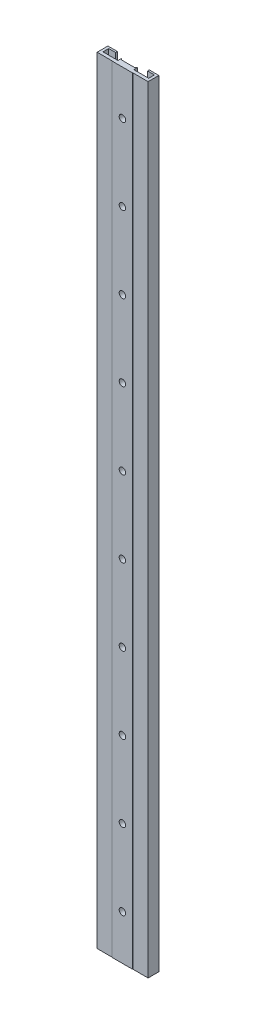
ISO-10303-21;
HEADER;
FILE_DESCRIPTION(('STEP AP214'),'2;1');
FILE_NAME('part.step','',(''),(''),'','','');
FILE_SCHEMA(('AUTOMOTIVE_DESIGN { 1 0 10303 214 1 1 1 1 }'));
ENDSEC;
DATA;
#1=APPLICATION_CONTEXT('core data for automotive mechanical design processes');
#2=APPLICATION_PROTOCOL_DEFINITION('international standard','automotive_design',2000,#1);
#3=PRODUCT_CONTEXT('',#1,'mechanical');
#4=PRODUCT('Part','Part','',(#3));
#5=PRODUCT_RELATED_PRODUCT_CATEGORY('part','',(#4));
#6=PRODUCT_DEFINITION_FORMATION('','',#4);
#7=PRODUCT_DEFINITION_CONTEXT('part definition',#1,'design');
#8=PRODUCT_DEFINITION('design','',#6,#7);
#9=PRODUCT_DEFINITION_SHAPE('','',#8);
#10=(LENGTH_UNIT() NAMED_UNIT(*) SI_UNIT(.MILLI.,.METRE.));
#11=(NAMED_UNIT(*) PLANE_ANGLE_UNIT() SI_UNIT($,.RADIAN.));
#12=(NAMED_UNIT(*) SI_UNIT($,.STERADIAN.) SOLID_ANGLE_UNIT());
#13=UNCERTAINTY_MEASURE_WITH_UNIT(LENGTH_MEASURE(1.E-05),#10,'distance_accuracy_value','');
#14=(GEOMETRIC_REPRESENTATION_CONTEXT(3) GLOBAL_UNCERTAINTY_ASSIGNED_CONTEXT((#13)) GLOBAL_UNIT_ASSIGNED_CONTEXT((#10,
#11,#12)) REPRESENTATION_CONTEXT('',''));
#15=CARTESIAN_POINT('',(0.,0.,0.));
#16=DIRECTION('',(0.,0.,1.));
#17=DIRECTION('',(1.,0.,0.));
#18=AXIS2_PLACEMENT_3D('',#15,#16,#17);
#19=CARTESIAN_POINT('',(32.512,609.6,0.));
#20=DIRECTION('',(-1.,0.,0.));
#21=DIRECTION('',(0.,0.,1.));
#22=AXIS2_PLACEMENT_3D('',#19,#20,#21);
#23=PLANE('',#22);
#24=DIRECTION('',(0.,0.,-1.));
#25=VECTOR('',#24,1.);
#26=CARTESIAN_POINT('',(32.512,0.,0.));
#27=LINE('',#26,#25);
#28=CARTESIAN_POINT('',(32.512,0.,-7.0612));
#29=VERTEX_POINT('',#28);
#30=CARTESIAN_POINT('',(32.512,0.,-8.4582));
#31=VERTEX_POINT('',#30);
#32=EDGE_CURVE('E233',#29,#31,#27,.T.);
#33=ORIENTED_EDGE('',*,*,#32,.F.);
#34=DIRECTION('',(0.,-1.,0.));
#35=VECTOR('',#34,1.);
#36=CARTESIAN_POINT('',(32.512,609.6,-7.0612));
#37=LINE('',#36,#35);
#38=CARTESIAN_POINT('',(32.512,609.6,-7.0612));
#39=VERTEX_POINT('',#38);
#40=EDGE_CURVE('E11',#39,#29,#37,.T.);
#41=ORIENTED_EDGE('',*,*,#40,.F.);
#42=DIRECTION('',(0.,0.,-1.));
#43=VECTOR('',#42,1.);
#44=CARTESIAN_POINT('',(32.512,609.6,0.));
#45=LINE('',#44,#43);
#46=CARTESIAN_POINT('',(32.512,609.6,-8.4582));
#47=VERTEX_POINT('',#46);
#48=EDGE_CURVE('E301',#39,#47,#45,.T.);
#49=ORIENTED_EDGE('',*,*,#48,.T.);
#50=DIRECTION('',(0.,-1.,0.));
#51=VECTOR('',#50,1.);
#52=CARTESIAN_POINT('',(32.512,609.6,-8.4582));
#53=LINE('',#52,#51);
#54=EDGE_CURVE('E148',#47,#31,#53,.T.);
#55=ORIENTED_EDGE('',*,*,#54,.T.);
#56=EDGE_LOOP('',(#33,#41,#49,#55));
#57=FACE_BOUND('',#56,.T.);
#58=ADVANCED_FACE('F41',(#57),#23,.T.);
#59=CARTESIAN_POINT('',(0.,609.6,-7.0612));
#60=DIRECTION('',(0.,0.,1.));
#61=DIRECTION('',(1.,0.,0.));
#62=AXIS2_PLACEMENT_3D('',#59,#60,#61);
#63=PLANE('',#62);
#64=DIRECTION('',(-1.,0.,0.));
#65=VECTOR('',#64,1.);
#66=CARTESIAN_POINT('',(0.,0.,-7.0612));
#67=LINE('',#66,#65);
#68=CARTESIAN_POINT('',(37.973,0.,-7.0612));
#69=VERTEX_POINT('',#68);
#70=EDGE_CURVE('E237',#69,#29,#67,.T.);
#71=ORIENTED_EDGE('',*,*,#70,.F.);
#72=DIRECTION('',(0.,-1.,0.));
#73=VECTOR('',#72,1.);
#74=CARTESIAN_POINT('',(37.973,609.6,-7.0612));
#75=LINE('',#74,#73);
#76=CARTESIAN_POINT('',(37.973,609.6,-7.0612));
#77=VERTEX_POINT('',#76);
#78=EDGE_CURVE('E51',#77,#69,#75,.T.);
#79=ORIENTED_EDGE('',*,*,#78,.F.);
#80=DIRECTION('',(-1.,0.,0.));
#81=VECTOR('',#80,1.);
#82=CARTESIAN_POINT('',(0.,609.6,-7.0612));
#83=LINE('',#82,#81);
#84=EDGE_CURVE('E409',#77,#39,#83,.T.);
#85=ORIENTED_EDGE('',*,*,#84,.T.);
#86=ORIENTED_EDGE('',*,*,#40,.T.);
#87=EDGE_LOOP('',(#71,#79,#85,#86));
#88=FACE_BOUND('',#87,.T.);
#89=ADVANCED_FACE('F467',(#88),#63,.T.);
#90=CARTESIAN_POINT('',(37.973,609.6,0.));
#91=DIRECTION('',(-1.,0.,0.));
#92=DIRECTION('',(0.,0.,1.));
#93=AXIS2_PLACEMENT_3D('',#90,#91,#92);
#94=PLANE('',#93);
#95=DIRECTION('',(0.,0.,-1.));
#96=VECTOR('',#95,1.);
#97=CARTESIAN_POINT('',(37.973,0.,0.));
#98=LINE('',#97,#96);
#99=CARTESIAN_POINT('',(37.973,0.,-2.54));
#100=VERTEX_POINT('',#99);
#101=EDGE_CURVE('E242',#100,#69,#98,.T.);
#102=ORIENTED_EDGE('',*,*,#101,.F.);
#103=DIRECTION('',(0.,-1.,0.));
#104=VECTOR('',#103,1.);
#105=CARTESIAN_POINT('',(37.973,609.6,-2.54));
#106=LINE('',#105,#104);
#107=CARTESIAN_POINT('',(37.973,609.6,-2.54));
#108=VERTEX_POINT('',#107);
#109=EDGE_CURVE('E344',#108,#100,#106,.T.);
#110=ORIENTED_EDGE('',*,*,#109,.F.);
#111=DIRECTION('',(0.,0.,-1.));
#112=VECTOR('',#111,1.);
#113=CARTESIAN_POINT('',(37.973,609.6,0.));
#114=LINE('',#113,#112);
#115=EDGE_CURVE('E412',#108,#77,#114,.T.);
#116=ORIENTED_EDGE('',*,*,#115,.T.);
#117=ORIENTED_EDGE('',*,*,#78,.T.);
#118=EDGE_LOOP('',(#102,#110,#116,#117));
#119=FACE_BOUND('',#118,.T.);
#120=ADVANCED_FACE('F470',(#119),#94,.T.);
#121=CARTESIAN_POINT('',(0.,609.6,-2.54));
#122=DIRECTION('',(0.,0.,-1.));
#123=DIRECTION('',(-1.,0.,0.));
#124=AXIS2_PLACEMENT_3D('',#121,#122,#123);
#125=PLANE('',#124);
#126=DIRECTION('',(1.,0.,0.));
#127=VECTOR('',#126,1.);
#128=CARTESIAN_POINT('',(0.,0.,-2.54));
#129=LINE('',#128,#127);
#130=CARTESIAN_POINT('',(26.2509,0.,-2.54));
#131=VERTEX_POINT('',#130);
#132=EDGE_CURVE('E246',#131,#100,#129,.T.);
#133=ORIENTED_EDGE('',*,*,#132,.F.);
#134=DIRECTION('',(0.,-1.,0.));
#135=VECTOR('',#134,1.);
#136=CARTESIAN_POINT('',(26.2509,609.6,-2.54));
#137=LINE('',#136,#135);
#138=CARTESIAN_POINT('',(26.2509,609.6,-2.54));
#139=VERTEX_POINT('',#138);
#140=EDGE_CURVE('E341',#139,#131,#137,.T.);
#141=ORIENTED_EDGE('',*,*,#140,.F.);
#142=DIRECTION('',(1.,0.,0.));
#143=VECTOR('',#142,1.);
#144=CARTESIAN_POINT('',(0.,609.6,-2.54));
#145=LINE('',#144,#143);
#146=EDGE_CURVE('E415',#139,#108,#145,.T.);
#147=ORIENTED_EDGE('',*,*,#146,.T.);
#148=ORIENTED_EDGE('',*,*,#109,.T.);
#149=EDGE_LOOP('',(#133,#141,#147,#148));
#150=FACE_BOUND('',#149,.T.);
#151=ADVANCED_FACE('F475',(#150),#125,.T.);
#152=CARTESIAN_POINT('',(26.2509,609.6,0.));
#153=DIRECTION('',(1.,0.,0.));
#154=DIRECTION('',(0.,0.,-1.));
#155=AXIS2_PLACEMENT_3D('',#152,#153,#154);
#156=PLANE('',#155);
#157=DIRECTION('',(0.,0.,1.));
#158=VECTOR('',#157,1.);
#159=CARTESIAN_POINT('',(26.2509,0.,0.));
#160=LINE('',#159,#158);
#161=CARTESIAN_POINT('',(26.2509,0.,-5.26999469496826));
#162=VERTEX_POINT('',#161);
#163=EDGE_CURVE('E250',#162,#131,#160,.T.);
#164=ORIENTED_EDGE('',*,*,#163,.F.);
#165=DIRECTION('',(0.,-1.,0.));
#166=VECTOR('',#165,1.);
#167=CARTESIAN_POINT('',(26.2509,609.6,-5.26999469496826));
#168=LINE('',#167,#166);
#169=CARTESIAN_POINT('',(26.2509,609.6,-5.26999469496826));
#170=VERTEX_POINT('',#169);
#171=EDGE_CURVE('E338',#170,#162,#168,.T.);
#172=ORIENTED_EDGE('',*,*,#171,.F.);
#173=DIRECTION('',(0.,0.,1.));
#174=VECTOR('',#173,1.);
#175=CARTESIAN_POINT('',(26.2509,609.6,0.));
#176=LINE('',#175,#174);
#177=EDGE_CURVE('E418',#170,#139,#176,.T.);
#178=ORIENTED_EDGE('',*,*,#177,.T.);
#179=ORIENTED_EDGE('',*,*,#140,.T.);
#180=EDGE_LOOP('',(#164,#172,#178,#179));
#181=FACE_BOUND('',#180,.T.);
#182=ADVANCED_FACE('F478',(#181),#156,.T.);
#183=CARTESIAN_POINT('',(10.4904526525158,609.6,10.4904526525159));
#184=DIRECTION('',(-0.707106781186546,0.,-0.707106781186549));
#185=DIRECTION('',(-0.707106781186549,0.,0.707106781186546));
#186=AXIS2_PLACEMENT_3D('',#183,#184,#185);
#187=PLANE('',#186);
#188=DIRECTION('',(0.707106781186549,0.,-0.707106781186546));
#189=VECTOR('',#188,1.);
#190=CARTESIAN_POINT('',(10.4904526525158,0.,10.4904526525159));
#191=LINE('',#190,#189);
#192=CARTESIAN_POINT('',(25.2989053050317,0.,-4.318));
#193=VERTEX_POINT('',#192);
#194=EDGE_CURVE('E255',#193,#162,#191,.T.);
#195=ORIENTED_EDGE('',*,*,#194,.F.);
#196=DIRECTION('',(0.,-1.,0.));
#197=VECTOR('',#196,1.);
#198=CARTESIAN_POINT('',(25.2989053050317,609.6,-4.318));
#199=LINE('',#198,#197);
#200=CARTESIAN_POINT('',(25.2989053050317,609.6,-4.318));
#201=VERTEX_POINT('',#200);
#202=EDGE_CURVE('E335',#201,#193,#199,.T.);
#203=ORIENTED_EDGE('',*,*,#202,.F.);
#204=DIRECTION('',(0.707106781186549,0.,-0.707106781186546));
#205=VECTOR('',#204,1.);
#206=CARTESIAN_POINT('',(10.4904526525158,609.6,10.4904526525159));
#207=LINE('',#206,#205);
#208=EDGE_CURVE('E422',#201,#170,#207,.T.);
#209=ORIENTED_EDGE('',*,*,#208,.T.);
#210=ORIENTED_EDGE('',*,*,#171,.T.);
#211=EDGE_LOOP('',(#195,#203,#209,#210));
#212=FACE_BOUND('',#211,.T.);
#213=ADVANCED_FACE('F483',(#212),#187,.T.);
#214=CARTESIAN_POINT('',(0.,609.6,-4.318));
#215=DIRECTION('',(0.,0.,-1.));
#216=DIRECTION('',(-1.,0.,0.));
#217=AXIS2_PLACEMENT_3D('',#214,#215,#216);
#218=PLANE('',#217);
#219=CARTESIAN_POINT('',(20.0024999999943,35.1790000000001,-4.318));
#220=DIRECTION('',(0.,0.,-1.));
#221=DIRECTION('',(-1.,0.,0.));
#222=AXIS2_PLACEMENT_3D('',#219,#220,#221);
#223=CIRCLE('',#222,2.54);
#224=CARTESIAN_POINT('',(17.4624999999943,35.1790000000001,-4.318));
#225=VERTEX_POINT('',#224);
#226=EDGE_CURVE('E391',#225,#225,#223,.T.);
#227=ORIENTED_EDGE('',*,*,#226,.F.);
#228=EDGE_LOOP('',(#227));
#229=FACE_BOUND('',#228,.T.);
#230=CARTESIAN_POINT('',(20.002499999995,95.1230000000001,-4.318));
#231=DIRECTION('',(0.,0.,-1.));
#232=DIRECTION('',(-1.,0.,0.));
#233=AXIS2_PLACEMENT_3D('',#230,#231,#232);
#234=CIRCLE('',#233,2.54);
#235=CARTESIAN_POINT('',(17.462499999995,95.1230000000001,-4.318));
#236=VERTEX_POINT('',#235);
#237=EDGE_CURVE('E381',#236,#236,#234,.T.);
#238=ORIENTED_EDGE('',*,*,#237,.F.);
#239=EDGE_LOOP('',(#238));
#240=FACE_BOUND('',#239,.T.);
#241=CARTESIAN_POINT('',(20.0024999999956,155.067,-4.318));
#242=DIRECTION('',(0.,0.,-1.));
#243=DIRECTION('',(-1.,0.,0.));
#244=AXIS2_PLACEMENT_3D('',#241,#242,#243);
#245=CIRCLE('',#244,2.54);
#246=CARTESIAN_POINT('',(17.4624999999956,155.067,-4.318));
#247=VERTEX_POINT('',#246);
#248=EDGE_CURVE('E378',#247,#247,#245,.T.);
#249=ORIENTED_EDGE('',*,*,#248,.F.);
#250=EDGE_LOOP('',(#249));
#251=FACE_BOUND('',#250,.T.);
#252=CARTESIAN_POINT('',(20.0024999999962,215.011,-4.318));
#253=DIRECTION('',(0.,0.,-1.));
#254=DIRECTION('',(-1.,0.,0.));
#255=AXIS2_PLACEMENT_3D('',#252,#253,#254);
#256=CIRCLE('',#255,2.54);
#257=CARTESIAN_POINT('',(17.4624999999962,215.011,-4.318));
#258=VERTEX_POINT('',#257);
#259=EDGE_CURVE('E375',#258,#258,#256,.T.);
#260=ORIENTED_EDGE('',*,*,#259,.F.);
#261=EDGE_LOOP('',(#260));
#262=FACE_BOUND('',#261,.T.);
#263=CARTESIAN_POINT('',(20.0024999999969,274.955,-4.318));
#264=DIRECTION('',(0.,0.,-1.));
#265=DIRECTION('',(-1.,0.,0.));
#266=AXIS2_PLACEMENT_3D('',#263,#264,#265);
#267=CIRCLE('',#266,2.54);
#268=CARTESIAN_POINT('',(17.4624999999969,274.955,-4.318));
#269=VERTEX_POINT('',#268);
#270=EDGE_CURVE('E371',#269,#269,#267,.T.);
#271=ORIENTED_EDGE('',*,*,#270,.F.);
#272=EDGE_LOOP('',(#271));
#273=FACE_BOUND('',#272,.T.);
#274=CARTESIAN_POINT('',(20.0024999999975,334.899,-4.318));
#275=DIRECTION('',(0.,0.,-1.));
#276=DIRECTION('',(-1.,0.,0.));
#277=AXIS2_PLACEMENT_3D('',#274,#275,#276);
#278=CIRCLE('',#277,2.54);
#279=CARTESIAN_POINT('',(17.4624999999975,334.899,-4.318));
#280=VERTEX_POINT('',#279);
#281=EDGE_CURVE('E367',#280,#280,#278,.T.);
#282=ORIENTED_EDGE('',*,*,#281,.F.);
#283=EDGE_LOOP('',(#282));
#284=FACE_BOUND('',#283,.T.);
#285=CARTESIAN_POINT('',(20.0024999999981,394.843,-4.318));
#286=DIRECTION('',(0.,0.,-1.));
#287=DIRECTION('',(-1.,0.,0.));
#288=AXIS2_PLACEMENT_3D('',#285,#286,#287);
#289=CIRCLE('',#288,2.54);
#290=CARTESIAN_POINT('',(17.4624999999981,394.843,-4.318));
#291=VERTEX_POINT('',#290);
#292=EDGE_CURVE('E363',#291,#291,#289,.T.);
#293=ORIENTED_EDGE('',*,*,#292,.F.);
#294=EDGE_LOOP('',(#293));
#295=FACE_BOUND('',#294,.T.);
#296=CARTESIAN_POINT('',(20.0024999999987,454.787,-4.318));
#297=DIRECTION('',(0.,0.,-1.));
#298=DIRECTION('',(-1.,0.,0.));
#299=AXIS2_PLACEMENT_3D('',#296,#297,#298);
#300=CIRCLE('',#299,2.54);
#301=CARTESIAN_POINT('',(17.4624999999987,454.787,-4.318));
#302=VERTEX_POINT('',#301);
#303=EDGE_CURVE('E359',#302,#302,#300,.T.);
#304=ORIENTED_EDGE('',*,*,#303,.F.);
#305=EDGE_LOOP('',(#304));
#306=FACE_BOUND('',#305,.T.);
#307=CARTESIAN_POINT('',(20.0024999999994,514.731,-4.318));
#308=DIRECTION('',(0.,0.,-1.));
#309=DIRECTION('',(-1.,0.,0.));
#310=AXIS2_PLACEMENT_3D('',#307,#308,#309);
#311=CIRCLE('',#310,2.53999999999999);
#312=CARTESIAN_POINT('',(17.4624999999994,514.731,-4.318));
#313=VERTEX_POINT('',#312);
#314=EDGE_CURVE('E355',#313,#313,#311,.T.);
#315=ORIENTED_EDGE('',*,*,#314,.F.);
#316=EDGE_LOOP('',(#315));
#317=FACE_BOUND('',#316,.T.);
#318=CARTESIAN_POINT('',(20.0025,574.675,-4.318));
#319=DIRECTION('',(0.,0.,-1.));
#320=DIRECTION('',(-1.,0.,0.));
#321=AXIS2_PLACEMENT_3D('',#318,#319,#320);
#322=CIRCLE('',#321,2.53999999999999);
#323=CARTESIAN_POINT('',(17.4625,574.675,-4.318));
#324=VERTEX_POINT('',#323);
#325=EDGE_CURVE('E351',#324,#324,#322,.T.);
#326=ORIENTED_EDGE('',*,*,#325,.F.);
#327=EDGE_LOOP('',(#326));
#328=FACE_BOUND('',#327,.T.);
#329=DIRECTION('',(1.,0.,0.));
#330=VECTOR('',#329,1.);
#331=CARTESIAN_POINT('',(0.,0.,-4.318));
#332=LINE('',#331,#330);
#333=CARTESIAN_POINT('',(14.7060946949683,0.,-4.318));
#334=VERTEX_POINT('',#333);
#335=EDGE_CURVE('E259',#334,#193,#332,.T.);
#336=ORIENTED_EDGE('',*,*,#335,.F.);
#337=DIRECTION('',(0.,-1.,0.));
#338=VECTOR('',#337,1.);
#339=CARTESIAN_POINT('',(14.7060946949683,609.6,-4.318));
#340=LINE('',#339,#338);
#341=CARTESIAN_POINT('',(14.7060946949683,609.6,-4.318));
#342=VERTEX_POINT('',#341);
#343=EDGE_CURVE('E333',#342,#334,#340,.T.);
#344=ORIENTED_EDGE('',*,*,#343,.F.);
#345=DIRECTION('',(1.,0.,0.));
#346=VECTOR('',#345,1.);
#347=CARTESIAN_POINT('',(0.,609.6,-4.318));
#348=LINE('',#347,#346);
#349=EDGE_CURVE('E425',#342,#201,#348,.T.);
#350=ORIENTED_EDGE('',*,*,#349,.T.);
#351=ORIENTED_EDGE('',*,*,#202,.T.);
#352=EDGE_LOOP('',(#336,#344,#350,#351));
#353=FACE_BOUND('',#352,.T.);
#354=ADVANCED_FACE('F486',(#229,#240,#251,#262,#273,#284,#295,#306,#317,#328,#353),#218,.T.);
#355=CARTESIAN_POINT('',(9.51204734748415,609.6,-9.51204734748413));
#356=DIRECTION('',(0.707106781186548,0.,-0.707106781186547));
#357=DIRECTION('',(-0.707106781186547,0.,-0.707106781186548));
#358=AXIS2_PLACEMENT_3D('',#355,#356,#357);
#359=PLANE('',#358);
#360=DIRECTION('',(0.707106781186547,0.,0.707106781186548));
#361=VECTOR('',#360,1.);
#362=CARTESIAN_POINT('',(9.51204734748415,0.,-9.51204734748413));
#363=LINE('',#362,#361);
#364=CARTESIAN_POINT('',(13.7541,0.,-5.26999469496826));
#365=VERTEX_POINT('',#364);
#366=EDGE_CURVE('E263',#365,#334,#363,.T.);
#367=ORIENTED_EDGE('',*,*,#366,.F.);
#368=DIRECTION('',(0.,-1.,0.));
#369=VECTOR('',#368,1.);
#370=CARTESIAN_POINT('',(13.7541,609.6,-5.26999469496826));
#371=LINE('',#370,#369);
#372=CARTESIAN_POINT('',(13.7541,609.6,-5.26999469496826));
#373=VERTEX_POINT('',#372);
#374=EDGE_CURVE('E331',#373,#365,#371,.T.);
#375=ORIENTED_EDGE('',*,*,#374,.F.);
#376=DIRECTION('',(0.707106781186547,0.,0.707106781186548));
#377=VECTOR('',#376,1.);
#378=CARTESIAN_POINT('',(9.51204734748415,609.6,-9.51204734748413));
#379=LINE('',#378,#377);
#380=EDGE_CURVE('E428',#373,#342,#379,.T.);
#381=ORIENTED_EDGE('',*,*,#380,.T.);
#382=ORIENTED_EDGE('',*,*,#343,.T.);
#383=EDGE_LOOP('',(#367,#375,#381,#382));
#384=FACE_BOUND('',#383,.T.);
#385=ADVANCED_FACE('F491',(#384),#359,.T.);
#386=CARTESIAN_POINT('',(13.7541,609.6,0.));
#387=DIRECTION('',(-1.,0.,0.));
#388=DIRECTION('',(0.,0.,1.));
#389=AXIS2_PLACEMENT_3D('',#386,#387,#388);
#390=PLANE('',#389);
#391=DIRECTION('',(0.,0.,-1.));
#392=VECTOR('',#391,1.);
#393=CARTESIAN_POINT('',(13.7541,0.,0.));
#394=LINE('',#393,#392);
#395=CARTESIAN_POINT('',(13.7541,0.,-2.54));
#396=VERTEX_POINT('',#395);
#397=EDGE_CURVE('E266',#396,#365,#394,.T.);
#398=ORIENTED_EDGE('',*,*,#397,.F.);
#399=DIRECTION('',(0.,-1.,0.));
#400=VECTOR('',#399,1.);
#401=CARTESIAN_POINT('',(13.7541,609.6,-2.54));
#402=LINE('',#401,#400);
#403=CARTESIAN_POINT('',(13.7541,609.6,-2.54));
#404=VERTEX_POINT('',#403);
#405=EDGE_CURVE('E329',#404,#396,#402,.T.);
#406=ORIENTED_EDGE('',*,*,#405,.F.);
#407=DIRECTION('',(0.,0.,-1.));
#408=VECTOR('',#407,1.);
#409=CARTESIAN_POINT('',(13.7541,609.6,0.));
#410=LINE('',#409,#408);
#411=EDGE_CURVE('E431',#404,#373,#410,.T.);
#412=ORIENTED_EDGE('',*,*,#411,.T.);
#413=ORIENTED_EDGE('',*,*,#374,.T.);
#414=EDGE_LOOP('',(#398,#406,#412,#413));
#415=FACE_BOUND('',#414,.T.);
#416=ADVANCED_FACE('F494',(#415),#390,.T.);
#417=CARTESIAN_POINT('',(2.032,0.,-2.54));
#418=VERTEX_POINT('',#417);
#419=EDGE_CURVE('E251',#418,#396,#129,.T.);
#420=ORIENTED_EDGE('',*,*,#419,.F.);
#421=DIRECTION('',(0.,-1.,0.));
#422=VECTOR('',#421,1.);
#423=CARTESIAN_POINT('',(2.032,609.6,-2.54));
#424=LINE('',#423,#422);
#425=CARTESIAN_POINT('',(2.032,609.6,-2.54));
#426=VERTEX_POINT('',#425);
#427=EDGE_CURVE('E327',#426,#418,#424,.T.);
#428=ORIENTED_EDGE('',*,*,#427,.F.);
#429=EDGE_CURVE('E419',#426,#404,#145,.T.);
#430=ORIENTED_EDGE('',*,*,#429,.T.);
#431=ORIENTED_EDGE('',*,*,#405,.T.);
#432=EDGE_LOOP('',(#420,#428,#430,#431));
#433=FACE_BOUND('',#432,.T.);
#434=ADVANCED_FACE('F501',(#433),#125,.T.);
#435=CARTESIAN_POINT('',(2.032,609.6,0.));
#436=DIRECTION('',(1.,0.,0.));
#437=DIRECTION('',(0.,0.,-1.));
#438=AXIS2_PLACEMENT_3D('',#435,#436,#437);
#439=PLANE('',#438);
#440=DIRECTION('',(0.,0.,1.));
#441=VECTOR('',#440,1.);
#442=CARTESIAN_POINT('',(2.032,0.,0.));
#443=LINE('',#442,#441);
#444=CARTESIAN_POINT('',(2.032,0.,-7.0612));
#445=VERTEX_POINT('',#444);
#446=EDGE_CURVE('E269',#445,#418,#443,.T.);
#447=ORIENTED_EDGE('',*,*,#446,.F.);
#448=DIRECTION('',(0.,-1.,0.));
#449=VECTOR('',#448,1.);
#450=CARTESIAN_POINT('',(2.032,609.6,-7.0612));
#451=LINE('',#450,#449);
#452=CARTESIAN_POINT('',(2.032,609.6,-7.0612));
#453=VERTEX_POINT('',#452);
#454=EDGE_CURVE('E325',#453,#445,#451,.T.);
#455=ORIENTED_EDGE('',*,*,#454,.F.);
#456=DIRECTION('',(0.,0.,1.));
#457=VECTOR('',#456,1.);
#458=CARTESIAN_POINT('',(2.032,609.6,0.));
#459=LINE('',#458,#457);
#460=EDGE_CURVE('E434',#453,#426,#459,.T.);
#461=ORIENTED_EDGE('',*,*,#460,.T.);
#462=ORIENTED_EDGE('',*,*,#427,.T.);
#463=EDGE_LOOP('',(#447,#455,#461,#462));
#464=FACE_BOUND('',#463,.T.);
#465=ADVANCED_FACE('F504',(#464),#439,.T.);
#466=CARTESIAN_POINT('',(0.,609.6,-7.0612));
#467=DIRECTION('',(0.,0.,1.));
#468=DIRECTION('',(1.,0.,0.));
#469=AXIS2_PLACEMENT_3D('',#466,#467,#468);
#470=PLANE('',#469);
#471=DIRECTION('',(-1.,0.,0.));
#472=VECTOR('',#471,1.);
#473=CARTESIAN_POINT('',(0.,0.,-7.0612));
#474=LINE('',#473,#472);
#475=CARTESIAN_POINT('',(7.493,0.,-7.0612));
#476=VERTEX_POINT('',#475);
#477=EDGE_CURVE('E272',#476,#445,#474,.T.);
#478=ORIENTED_EDGE('',*,*,#477,.F.);
#479=DIRECTION('',(0.,-1.,0.));
#480=VECTOR('',#479,1.);
#481=CARTESIAN_POINT('',(7.493,609.6,-7.0612));
#482=LINE('',#481,#480);
#483=CARTESIAN_POINT('',(7.493,609.6,-7.0612));
#484=VERTEX_POINT('',#483);
#485=EDGE_CURVE('E323',#484,#476,#482,.T.);
#486=ORIENTED_EDGE('',*,*,#485,.F.);
#487=DIRECTION('',(-1.,0.,0.));
#488=VECTOR('',#487,1.);
#489=CARTESIAN_POINT('',(0.,609.6,-7.0612));
#490=LINE('',#489,#488);
#491=EDGE_CURVE('E437',#484,#453,#490,.T.);
#492=ORIENTED_EDGE('',*,*,#491,.T.);
#493=ORIENTED_EDGE('',*,*,#454,.T.);
#494=EDGE_LOOP('',(#478,#486,#492,#493));
#495=FACE_BOUND('',#494,.T.);
#496=ADVANCED_FACE('F509',(#495),#470,.T.);
#497=CARTESIAN_POINT('',(7.493,609.6,0.));
#498=DIRECTION('',(1.,0.,0.));
#499=DIRECTION('',(0.,0.,-1.));
#500=AXIS2_PLACEMENT_3D('',#497,#498,#499);
#501=PLANE('',#500);
#502=DIRECTION('',(0.,0.,1.));
#503=VECTOR('',#502,1.);
#504=CARTESIAN_POINT('',(7.493,0.,0.));
#505=LINE('',#504,#503);
#506=CARTESIAN_POINT('',(7.493,0.,-8.4582));
#507=VERTEX_POINT('',#506);
#508=EDGE_CURVE('E275',#507,#476,#505,.T.);
#509=ORIENTED_EDGE('',*,*,#508,.F.);
#510=DIRECTION('',(0.,-1.,0.));
#511=VECTOR('',#510,1.);
#512=CARTESIAN_POINT('',(7.493,609.6,-8.4582));
#513=LINE('',#512,#511);
#514=CARTESIAN_POINT('',(7.493,609.6,-8.4582));
#515=VERTEX_POINT('',#514);
#516=EDGE_CURVE('E321',#515,#507,#513,.T.);
#517=ORIENTED_EDGE('',*,*,#516,.F.);
#518=DIRECTION('',(0.,0.,1.));
#519=VECTOR('',#518,1.);
#520=CARTESIAN_POINT('',(7.493,609.6,0.));
#521=LINE('',#520,#519);
#522=EDGE_CURVE('E440',#515,#484,#521,.T.);
#523=ORIENTED_EDGE('',*,*,#522,.T.);
#524=ORIENTED_EDGE('',*,*,#485,.T.);
#525=EDGE_LOOP('',(#509,#517,#523,#524));
#526=FACE_BOUND('',#525,.T.);
#527=ADVANCED_FACE('F512',(#526),#501,.T.);
#528=CARTESIAN_POINT('',(0.,609.6,-8.4582));
#529=DIRECTION('',(0.,0.,-1.));
#530=DIRECTION('',(-1.,0.,0.));
#531=AXIS2_PLACEMENT_3D('',#528,#529,#530);
#532=PLANE('',#531);
#533=DIRECTION('',(1.,0.,0.));
#534=VECTOR('',#533,1.);
#535=CARTESIAN_POINT('',(0.,0.,-8.4582));
#536=LINE('',#535,#534);
#537=CARTESIAN_POINT('',(0.,0.,-8.4582));
#538=VERTEX_POINT('',#537);
#539=EDGE_CURVE('E278',#538,#507,#536,.T.);
#540=ORIENTED_EDGE('',*,*,#539,.F.);
#541=DIRECTION('',(0.,-1.,0.));
#542=VECTOR('',#541,1.);
#543=CARTESIAN_POINT('',(0.,609.6,-8.4582));
#544=LINE('',#543,#542);
#545=CARTESIAN_POINT('',(0.,609.6,-8.4582));
#546=VERTEX_POINT('',#545);
#547=EDGE_CURVE('E319',#546,#538,#544,.T.);
#548=ORIENTED_EDGE('',*,*,#547,.F.);
#549=DIRECTION('',(1.,0.,0.));
#550=VECTOR('',#549,1.);
#551=CARTESIAN_POINT('',(0.,609.6,-8.4582));
#552=LINE('',#551,#550);
#553=EDGE_CURVE('E443',#546,#515,#552,.T.);
#554=ORIENTED_EDGE('',*,*,#553,.T.);
#555=ORIENTED_EDGE('',*,*,#516,.T.);
#556=EDGE_LOOP('',(#540,#548,#554,#555));
#557=FACE_BOUND('',#556,.T.);
#558=ADVANCED_FACE('F517',(#557),#532,.T.);
#559=CARTESIAN_POINT('',(0.,609.6,0.));
#560=DIRECTION('',(-1.,0.,0.));
#561=DIRECTION('',(0.,0.,1.));
#562=AXIS2_PLACEMENT_3D('',#559,#560,#561);
#563=PLANE('',#562);
#564=DIRECTION('',(0.,0.,-1.));
#565=VECTOR('',#564,1.);
#566=CARTESIAN_POINT('',(0.,0.,0.));
#567=LINE('',#566,#565);
#568=CARTESIAN_POINT('',(0.,0.,0.));
#569=VERTEX_POINT('',#568);
#570=EDGE_CURVE('E281',#569,#538,#567,.T.);
#571=ORIENTED_EDGE('',*,*,#570,.F.);
#572=DIRECTION('',(0.,-1.,0.));
#573=VECTOR('',#572,1.);
#574=CARTESIAN_POINT('',(0.,609.6,0.));
#575=LINE('',#574,#573);
#576=CARTESIAN_POINT('',(0.,609.6,0.));
#577=VERTEX_POINT('',#576);
#578=EDGE_CURVE('E317',#577,#569,#575,.T.);
#579=ORIENTED_EDGE('',*,*,#578,.F.);
#580=DIRECTION('',(0.,0.,-1.));
#581=VECTOR('',#580,1.);
#582=CARTESIAN_POINT('',(0.,609.6,0.));
#583=LINE('',#582,#581);
#584=EDGE_CURVE('E446',#577,#546,#583,.T.);
#585=ORIENTED_EDGE('',*,*,#584,.T.);
#586=ORIENTED_EDGE('',*,*,#547,.T.);
#587=EDGE_LOOP('',(#571,#579,#585,#586));
#588=FACE_BOUND('',#587,.T.);
#589=ADVANCED_FACE('F520',(#588),#563,.T.);
#590=CARTESIAN_POINT('',(0.,609.6,0.));
#591=DIRECTION('',(0.,0.,-1.));
#592=DIRECTION('',(-1.,0.,0.));
#593=AXIS2_PLACEMENT_3D('',#590,#591,#592);
#594=PLANE('',#593);
#595=DIRECTION('',(1.,0.,0.));
#596=VECTOR('',#595,1.);
#597=CARTESIAN_POINT('',(0.,0.,0.));
#598=LINE('',#597,#596);
#599=CARTESIAN_POINT('',(11.9761,0.,0.));
#600=VERTEX_POINT('',#599);
#601=EDGE_CURVE('E284',#569,#600,#598,.T.);
#602=ORIENTED_EDGE('',*,*,#601,.T.);
#603=DIRECTION('',(0.,-1.,0.));
#604=VECTOR('',#603,1.);
#605=CARTESIAN_POINT('',(11.9761,609.6,0.));
#606=LINE('',#605,#604);
#607=CARTESIAN_POINT('',(11.9761,609.6,0.));
#608=VERTEX_POINT('',#607);
#609=EDGE_CURVE('E314',#608,#600,#606,.T.);
#610=ORIENTED_EDGE('',*,*,#609,.F.);
#611=DIRECTION('',(1.,0.,0.));
#612=VECTOR('',#611,1.);
#613=CARTESIAN_POINT('',(0.,609.6,0.));
#614=LINE('',#613,#612);
#615=EDGE_CURVE('E218',#577,#608,#614,.T.);
#616=ORIENTED_EDGE('',*,*,#615,.F.);
#617=ORIENTED_EDGE('',*,*,#578,.T.);
#618=EDGE_LOOP('',(#602,#610,#616,#617));
#619=FACE_BOUND('',#618,.T.);
#620=ADVANCED_FACE('F526',(#619),#594,.F.);
#621=CARTESIAN_POINT('',(11.9761,609.6,0.));
#622=DIRECTION('',(1.,0.,0.));
#623=DIRECTION('',(0.,0.,-1.));
#624=AXIS2_PLACEMENT_3D('',#621,#622,#623);
#625=PLANE('',#624);
#626=DIRECTION('',(0.,0.,1.));
#627=VECTOR('',#626,1.);
#628=CARTESIAN_POINT('',(11.9761,0.,0.));
#629=LINE('',#628,#627);
#630=CARTESIAN_POINT('',(11.9761,0.,0.1524));
#631=VERTEX_POINT('',#630);
#632=EDGE_CURVE('E286',#600,#631,#629,.T.);
#633=ORIENTED_EDGE('',*,*,#632,.T.);
#634=DIRECTION('',(0.,-1.,0.));
#635=VECTOR('',#634,1.);
#636=CARTESIAN_POINT('',(11.9761,609.6,0.1524));
#637=LINE('',#636,#635);
#638=CARTESIAN_POINT('',(11.9761,609.6,0.1524));
#639=VERTEX_POINT('',#638);
#640=EDGE_CURVE('E311',#639,#631,#637,.T.);
#641=ORIENTED_EDGE('',*,*,#640,.F.);
#642=DIRECTION('',(0.,0.,1.));
#643=VECTOR('',#642,1.);
#644=CARTESIAN_POINT('',(11.9761,609.6,0.));
#645=LINE('',#644,#643);
#646=EDGE_CURVE('E449',#608,#639,#645,.T.);
#647=ORIENTED_EDGE('',*,*,#646,.F.);
#648=ORIENTED_EDGE('',*,*,#609,.T.);
#649=EDGE_LOOP('',(#633,#641,#647,#648));
#650=FACE_BOUND('',#649,.T.);
#651=ADVANCED_FACE('F530',(#650),#625,.F.);
#652=CARTESIAN_POINT('',(0.,609.6,0.1524));
#653=DIRECTION('',(0.,0.,-1.));
#654=DIRECTION('',(-1.,0.,0.));
#655=AXIS2_PLACEMENT_3D('',#652,#653,#654);
#656=PLANE('',#655);
#657=CARTESIAN_POINT('',(20.0024999999943,35.1790000000001,0.152400000000052));
#658=DIRECTION('',(0.,0.,-1.));
#659=DIRECTION('',(-1.,0.,0.));
#660=AXIS2_PLACEMENT_3D('',#657,#658,#659);
#661=CIRCLE('',#660,2.54);
#662=CARTESIAN_POINT('',(17.4624999999943,35.1790000000001,0.152400000000052));
#663=VERTEX_POINT('',#662);
#664=EDGE_CURVE('E44',#663,#663,#661,.T.);
#665=ORIENTED_EDGE('',*,*,#664,.T.);
#666=EDGE_LOOP('',(#665));
#667=FACE_BOUND('',#666,.T.);
#668=CARTESIAN_POINT('',(20.002499999995,95.1230000000001,0.152400000000052));
#669=DIRECTION('',(0.,0.,-1.));
#670=DIRECTION('',(-1.,0.,0.));
#671=AXIS2_PLACEMENT_3D('',#668,#669,#670);
#672=CIRCLE('',#671,2.54);
#673=CARTESIAN_POINT('',(17.462499999995,95.1230000000001,0.152400000000052));
#674=VERTEX_POINT('',#673);
#675=EDGE_CURVE('E379',#674,#674,#672,.T.);
#676=ORIENTED_EDGE('',*,*,#675,.T.);
#677=EDGE_LOOP('',(#676));
#678=FACE_BOUND('',#677,.T.);
#679=CARTESIAN_POINT('',(20.0024999999956,155.067,0.152400000000052));
#680=DIRECTION('',(0.,0.,-1.));
#681=DIRECTION('',(-1.,0.,0.));
#682=AXIS2_PLACEMENT_3D('',#679,#680,#681);
#683=CIRCLE('',#682,2.54);
#684=CARTESIAN_POINT('',(17.4624999999956,155.067,0.152400000000052));
#685=VERTEX_POINT('',#684);
#686=EDGE_CURVE('E376',#685,#685,#683,.T.);
#687=ORIENTED_EDGE('',*,*,#686,.T.);
#688=EDGE_LOOP('',(#687));
#689=FACE_BOUND('',#688,.T.);
#690=CARTESIAN_POINT('',(20.0024999999962,215.011,0.152400000000052));
#691=DIRECTION('',(0.,0.,-1.));
#692=DIRECTION('',(-1.,0.,0.));
#693=AXIS2_PLACEMENT_3D('',#690,#691,#692);
#694=CIRCLE('',#693,2.54);
#695=CARTESIAN_POINT('',(17.4624999999962,215.011,0.152400000000052));
#696=VERTEX_POINT('',#695);
#697=EDGE_CURVE('E372',#696,#696,#694,.T.);
#698=ORIENTED_EDGE('',*,*,#697,.T.);
#699=EDGE_LOOP('',(#698));
#700=FACE_BOUND('',#699,.T.);
#701=CARTESIAN_POINT('',(20.0024999999969,274.955,0.152400000000052));
#702=DIRECTION('',(0.,0.,-1.));
#703=DIRECTION('',(-1.,0.,0.));
#704=AXIS2_PLACEMENT_3D('',#701,#702,#703);
#705=CIRCLE('',#704,2.54);
#706=CARTESIAN_POINT('',(17.4624999999969,274.955,0.152400000000052));
#707=VERTEX_POINT('',#706);
#708=EDGE_CURVE('E368',#707,#707,#705,.T.);
#709=ORIENTED_EDGE('',*,*,#708,.T.);
#710=EDGE_LOOP('',(#709));
#711=FACE_BOUND('',#710,.T.);
#712=CARTESIAN_POINT('',(20.0024999999975,334.899,0.152400000000052));
#713=DIRECTION('',(0.,0.,-1.));
#714=DIRECTION('',(-1.,0.,0.));
#715=AXIS2_PLACEMENT_3D('',#712,#713,#714);
#716=CIRCLE('',#715,2.54);
#717=CARTESIAN_POINT('',(17.4624999999975,334.899,0.152400000000052));
#718=VERTEX_POINT('',#717);
#719=EDGE_CURVE('E364',#718,#718,#716,.T.);
#720=ORIENTED_EDGE('',*,*,#719,.T.);
#721=EDGE_LOOP('',(#720));
#722=FACE_BOUND('',#721,.T.);
#723=CARTESIAN_POINT('',(20.0024999999981,394.843,0.152400000000052));
#724=DIRECTION('',(0.,0.,-1.));
#725=DIRECTION('',(-1.,0.,0.));
#726=AXIS2_PLACEMENT_3D('',#723,#724,#725);
#727=CIRCLE('',#726,2.54);
#728=CARTESIAN_POINT('',(17.4624999999981,394.843,0.152400000000052));
#729=VERTEX_POINT('',#728);
#730=EDGE_CURVE('E360',#729,#729,#727,.T.);
#731=ORIENTED_EDGE('',*,*,#730,.T.);
#732=EDGE_LOOP('',(#731));
#733=FACE_BOUND('',#732,.T.);
#734=CARTESIAN_POINT('',(20.0024999999987,454.787,0.152400000000052));
#735=DIRECTION('',(0.,0.,-1.));
#736=DIRECTION('',(-1.,0.,0.));
#737=AXIS2_PLACEMENT_3D('',#734,#735,#736);
#738=CIRCLE('',#737,2.54);
#739=CARTESIAN_POINT('',(17.4624999999987,454.787,0.152400000000052));
#740=VERTEX_POINT('',#739);
#741=EDGE_CURVE('E356',#740,#740,#738,.T.);
#742=ORIENTED_EDGE('',*,*,#741,.T.);
#743=EDGE_LOOP('',(#742));
#744=FACE_BOUND('',#743,.T.);
#745=CARTESIAN_POINT('',(20.0024999999994,514.731,0.152400000000052));
#746=DIRECTION('',(0.,0.,-1.));
#747=DIRECTION('',(-1.,0.,0.));
#748=AXIS2_PLACEMENT_3D('',#745,#746,#747);
#749=CIRCLE('',#748,2.53999999999999);
#750=CARTESIAN_POINT('',(17.4624999999994,514.731,0.152400000000052));
#751=VERTEX_POINT('',#750);
#752=EDGE_CURVE('E352',#751,#751,#749,.T.);
#753=ORIENTED_EDGE('',*,*,#752,.T.);
#754=EDGE_LOOP('',(#753));
#755=FACE_BOUND('',#754,.T.);
#756=CARTESIAN_POINT('',(20.0025,574.675,0.152400000000052));
#757=DIRECTION('',(0.,0.,-1.));
#758=DIRECTION('',(-1.,0.,0.));
#759=AXIS2_PLACEMENT_3D('',#756,#757,#758);
#760=CIRCLE('',#759,2.53999999999999);
#761=CARTESIAN_POINT('',(17.4625,574.675,0.152400000000052));
#762=VERTEX_POINT('',#761);
#763=EDGE_CURVE('E238',#762,#762,#760,.T.);
#764=ORIENTED_EDGE('',*,*,#763,.T.);
#765=EDGE_LOOP('',(#764));
#766=FACE_BOUND('',#765,.T.);
#767=DIRECTION('',(1.,0.,0.));
#768=VECTOR('',#767,1.);
#769=CARTESIAN_POINT('',(0.,0.,0.1524));
#770=LINE('',#769,#768);
#771=CARTESIAN_POINT('',(28.0289,0.,0.1524));
#772=VERTEX_POINT('',#771);
#773=EDGE_CURVE('E288',#631,#772,#770,.T.);
#774=ORIENTED_EDGE('',*,*,#773,.T.);
#775=DIRECTION('',(0.,-1.,0.));
#776=VECTOR('',#775,1.);
#777=CARTESIAN_POINT('',(28.0289,609.6,0.1524));
#778=LINE('',#777,#776);
#779=CARTESIAN_POINT('',(28.0289,609.6,0.1524));
#780=VERTEX_POINT('',#779);
#781=EDGE_CURVE('E308',#780,#772,#778,.T.);
#782=ORIENTED_EDGE('',*,*,#781,.F.);
#783=DIRECTION('',(1.,0.,0.));
#784=VECTOR('',#783,1.);
#785=CARTESIAN_POINT('',(0.,609.6,0.1524));
#786=LINE('',#785,#784);
#787=EDGE_CURVE('E450',#639,#780,#786,.T.);
#788=ORIENTED_EDGE('',*,*,#787,.F.);
#789=ORIENTED_EDGE('',*,*,#640,.T.);
#790=EDGE_LOOP('',(#774,#782,#788,#789));
#791=FACE_BOUND('',#790,.T.);
#792=ADVANCED_FACE('F532',(#667,#678,#689,#700,#711,#722,#733,#744,#755,#766,#791),#656,.F.);
#793=CARTESIAN_POINT('',(28.0289,609.6,0.));
#794=DIRECTION('',(1.,0.,0.));
#795=DIRECTION('',(0.,0.,-1.));
#796=AXIS2_PLACEMENT_3D('',#793,#794,#795);
#797=PLANE('',#796);
#798=DIRECTION('',(0.,0.,1.));
#799=VECTOR('',#798,1.);
#800=CARTESIAN_POINT('',(28.0289,0.,0.));
#801=LINE('',#800,#799);
#802=CARTESIAN_POINT('',(28.0289,0.,0.));
#803=VERTEX_POINT('',#802);
#804=EDGE_CURVE('E292',#803,#772,#801,.T.);
#805=ORIENTED_EDGE('',*,*,#804,.F.);
#806=DIRECTION('',(0.,-1.,0.));
#807=VECTOR('',#806,1.);
#808=CARTESIAN_POINT('',(28.0289,609.6,0.));
#809=LINE('',#808,#807);
#810=CARTESIAN_POINT('',(28.0289,609.6,0.));
#811=VERTEX_POINT('',#810);
#812=EDGE_CURVE('E224',#811,#803,#809,.T.);
#813=ORIENTED_EDGE('',*,*,#812,.F.);
#814=DIRECTION('',(0.,0.,1.));
#815=VECTOR('',#814,1.);
#816=CARTESIAN_POINT('',(28.0289,609.6,0.));
#817=LINE('',#816,#815);
#818=EDGE_CURVE('E215',#811,#780,#817,.T.);
#819=ORIENTED_EDGE('',*,*,#818,.T.);
#820=ORIENTED_EDGE('',*,*,#781,.T.);
#821=EDGE_LOOP('',(#805,#813,#819,#820));
#822=FACE_BOUND('',#821,.T.);
#823=ADVANCED_FACE('F455',(#822),#797,.T.);
#824=CARTESIAN_POINT('',(40.005,0.,0.));
#825=VERTEX_POINT('',#824);
#826=EDGE_CURVE('E222',#803,#825,#598,.T.);
#827=ORIENTED_EDGE('',*,*,#826,.T.);
#828=DIRECTION('',(0.,-1.,0.));
#829=VECTOR('',#828,1.);
#830=CARTESIAN_POINT('',(40.005,609.6,0.));
#831=LINE('',#830,#829);
#832=CARTESIAN_POINT('',(40.005,609.6,0.));
#833=VERTEX_POINT('',#832);
#834=EDGE_CURVE('E219',#833,#825,#831,.T.);
#835=ORIENTED_EDGE('',*,*,#834,.F.);
#836=EDGE_CURVE('E209',#811,#833,#614,.T.);
#837=ORIENTED_EDGE('',*,*,#836,.F.);
#838=ORIENTED_EDGE('',*,*,#812,.T.);
#839=EDGE_LOOP('',(#827,#835,#837,#838));
#840=FACE_BOUND('',#839,.T.);
#841=ADVANCED_FACE('F220',(#840),#594,.F.);
#842=CARTESIAN_POINT('',(40.005,609.6,0.));
#843=DIRECTION('',(-1.,0.,0.));
#844=DIRECTION('',(0.,0.,1.));
#845=AXIS2_PLACEMENT_3D('',#842,#843,#844);
#846=PLANE('',#845);
#847=DIRECTION('',(0.,0.,-1.));
#848=VECTOR('',#847,1.);
#849=CARTESIAN_POINT('',(40.005,0.,0.));
#850=LINE('',#849,#848);
#851=CARTESIAN_POINT('',(40.005,0.,-8.4582));
#852=VERTEX_POINT('',#851);
#853=EDGE_CURVE('E140',#825,#852,#850,.T.);
#854=ORIENTED_EDGE('',*,*,#853,.T.);
#855=DIRECTION('',(0.,-1.,0.));
#856=VECTOR('',#855,1.);
#857=CARTESIAN_POINT('',(40.005,609.6,-8.4582));
#858=LINE('',#857,#856);
#859=CARTESIAN_POINT('',(40.005,609.6,-8.4582));
#860=VERTEX_POINT('',#859);
#861=EDGE_CURVE('E225',#860,#852,#858,.T.);
#862=ORIENTED_EDGE('',*,*,#861,.F.);
#863=DIRECTION('',(0.,0.,-1.));
#864=VECTOR('',#863,1.);
#865=CARTESIAN_POINT('',(40.005,609.6,0.));
#866=LINE('',#865,#864);
#867=EDGE_CURVE('E213',#833,#860,#866,.T.);
#868=ORIENTED_EDGE('',*,*,#867,.F.);
#869=ORIENTED_EDGE('',*,*,#834,.T.);
#870=EDGE_LOOP('',(#854,#862,#868,#869));
#871=FACE_BOUND('',#870,.T.);
#872=ADVANCED_FACE('F227',(#871),#846,.F.);
#873=CARTESIAN_POINT('',(0.,609.6,-8.45819999999998));
#874=DIRECTION('',(0.,0.,1.));
#875=DIRECTION('',(1.,0.,0.));
#876=AXIS2_PLACEMENT_3D('',#873,#874,#875);
#877=PLANE('',#876);
#878=DIRECTION('',(-1.,0.,0.));
#879=VECTOR('',#878,1.);
#880=CARTESIAN_POINT('',(0.,0.,-8.45819999999998));
#881=LINE('',#880,#879);
#882=EDGE_CURVE('E298',#852,#31,#881,.T.);
#883=ORIENTED_EDGE('',*,*,#882,.T.);
#884=ORIENTED_EDGE('',*,*,#54,.F.);
#885=DIRECTION('',(-1.,0.,0.));
#886=VECTOR('',#885,1.);
#887=CARTESIAN_POINT('',(0.,609.6,-8.45819999999998));
#888=LINE('',#887,#886);
#889=EDGE_CURVE('E60',#860,#47,#888,.T.);
#890=ORIENTED_EDGE('',*,*,#889,.F.);
#891=ORIENTED_EDGE('',*,*,#861,.T.);
#892=EDGE_LOOP('',(#883,#884,#890,#891));
#893=FACE_BOUND('',#892,.T.);
#894=ADVANCED_FACE('F462',(#893),#877,.F.);
#895=CARTESIAN_POINT('',(0.,609.6,0.));
#896=DIRECTION('',(0.,1.,0.));
#897=DIRECTION('',(0.,0.,1.));
#898=AXIS2_PLACEMENT_3D('',#895,#896,#897);
#899=PLANE('',#898);
#900=ORIENTED_EDGE('',*,*,#48,.F.);
#901=ORIENTED_EDGE('',*,*,#84,.F.);
#902=ORIENTED_EDGE('',*,*,#115,.F.);
#903=ORIENTED_EDGE('',*,*,#146,.F.);
#904=ORIENTED_EDGE('',*,*,#177,.F.);
#905=ORIENTED_EDGE('',*,*,#208,.F.);
#906=ORIENTED_EDGE('',*,*,#349,.F.);
#907=ORIENTED_EDGE('',*,*,#380,.F.);
#908=ORIENTED_EDGE('',*,*,#411,.F.);
#909=ORIENTED_EDGE('',*,*,#429,.F.);
#910=ORIENTED_EDGE('',*,*,#460,.F.);
#911=ORIENTED_EDGE('',*,*,#491,.F.);
#912=ORIENTED_EDGE('',*,*,#522,.F.);
#913=ORIENTED_EDGE('',*,*,#553,.F.);
#914=ORIENTED_EDGE('',*,*,#584,.F.);
#915=ORIENTED_EDGE('',*,*,#615,.T.);
#916=ORIENTED_EDGE('',*,*,#646,.T.);
#917=ORIENTED_EDGE('',*,*,#787,.T.);
#918=ORIENTED_EDGE('',*,*,#818,.F.);
#919=ORIENTED_EDGE('',*,*,#836,.T.);
#920=ORIENTED_EDGE('',*,*,#867,.T.);
#921=ORIENTED_EDGE('',*,*,#889,.T.);
#922=EDGE_LOOP('',(#900,#901,#902,#903,#904,#905,#906,#907,#908,#909,#910,#911,#912,#913,#914,
#915,#916,#917,#918,#919,#920,#921));
#923=FACE_BOUND('',#922,.T.);
#924=ADVANCED_FACE('F211',(#923),#899,.T.);
#925=CARTESIAN_POINT('',(0.,0.,0.));
#926=DIRECTION('',(0.,1.,0.));
#927=DIRECTION('',(0.,0.,1.));
#928=AXIS2_PLACEMENT_3D('',#925,#926,#927);
#929=PLANE('',#928);
#930=ORIENTED_EDGE('',*,*,#32,.T.);
#931=ORIENTED_EDGE('',*,*,#882,.F.);
#932=ORIENTED_EDGE('',*,*,#853,.F.);
#933=ORIENTED_EDGE('',*,*,#826,.F.);
#934=ORIENTED_EDGE('',*,*,#804,.T.);
#935=ORIENTED_EDGE('',*,*,#773,.F.);
#936=ORIENTED_EDGE('',*,*,#632,.F.);
#937=ORIENTED_EDGE('',*,*,#601,.F.);
#938=ORIENTED_EDGE('',*,*,#570,.T.);
#939=ORIENTED_EDGE('',*,*,#539,.T.);
#940=ORIENTED_EDGE('',*,*,#508,.T.);
#941=ORIENTED_EDGE('',*,*,#477,.T.);
#942=ORIENTED_EDGE('',*,*,#446,.T.);
#943=ORIENTED_EDGE('',*,*,#419,.T.);
#944=ORIENTED_EDGE('',*,*,#397,.T.);
#945=ORIENTED_EDGE('',*,*,#366,.T.);
#946=ORIENTED_EDGE('',*,*,#335,.T.);
#947=ORIENTED_EDGE('',*,*,#194,.T.);
#948=ORIENTED_EDGE('',*,*,#163,.T.);
#949=ORIENTED_EDGE('',*,*,#132,.T.);
#950=ORIENTED_EDGE('',*,*,#101,.T.);
#951=ORIENTED_EDGE('',*,*,#70,.T.);
#952=EDGE_LOOP('',(#930,#931,#932,#933,#934,#935,#936,#937,#938,#939,#940,#941,#942,#943,#944,
#945,#946,#947,#948,#949,#950,#951));
#953=FACE_BOUND('',#952,.T.);
#954=ADVANCED_FACE('F457',(#953),#929,.F.);
#955=CARTESIAN_POINT('',(20.0025,574.675,503.682));
#956=DIRECTION('',(0.,0.,-1.));
#957=DIRECTION('',(-1.,0.,0.));
#958=AXIS2_PLACEMENT_3D('',#955,#956,#957);
#959=CYLINDRICAL_SURFACE('',#958,2.53999999999999);
#960=ORIENTED_EDGE('',*,*,#325,.T.);
#961=EDGE_LOOP('',(#960));
#962=FACE_BOUND('',#961,.T.);
#963=ORIENTED_EDGE('',*,*,#763,.F.);
#964=EDGE_LOOP('',(#963));
#965=FACE_BOUND('',#964,.T.);
#966=ADVANCED_FACE('F591',(#962,#965),#959,.F.);
#967=CARTESIAN_POINT('',(20.0024999999994,514.731,503.682));
#968=DIRECTION('',(0.,0.,-1.));
#969=DIRECTION('',(-1.,0.,0.));
#970=AXIS2_PLACEMENT_3D('',#967,#968,#969);
#971=CYLINDRICAL_SURFACE('',#970,2.53999999999999);
#972=ORIENTED_EDGE('',*,*,#314,.T.);
#973=EDGE_LOOP('',(#972));
#974=FACE_BOUND('',#973,.T.);
#975=ORIENTED_EDGE('',*,*,#752,.F.);
#976=EDGE_LOOP('',(#975));
#977=FACE_BOUND('',#976,.T.);
#978=ADVANCED_FACE('F596',(#974,#977),#971,.F.);
#979=CARTESIAN_POINT('',(20.0024999999987,454.787,503.682));
#980=DIRECTION('',(0.,0.,-1.));
#981=DIRECTION('',(-1.,0.,0.));
#982=AXIS2_PLACEMENT_3D('',#979,#980,#981);
#983=CYLINDRICAL_SURFACE('',#982,2.54);
#984=ORIENTED_EDGE('',*,*,#303,.T.);
#985=EDGE_LOOP('',(#984));
#986=FACE_BOUND('',#985,.T.);
#987=ORIENTED_EDGE('',*,*,#741,.F.);
#988=EDGE_LOOP('',(#987));
#989=FACE_BOUND('',#988,.T.);
#990=ADVANCED_FACE('F600',(#986,#989),#983,.F.);
#991=CARTESIAN_POINT('',(20.0024999999981,394.843,503.682));
#992=DIRECTION('',(0.,0.,-1.));
#993=DIRECTION('',(-1.,0.,0.));
#994=AXIS2_PLACEMENT_3D('',#991,#992,#993);
#995=CYLINDRICAL_SURFACE('',#994,2.54);
#996=ORIENTED_EDGE('',*,*,#292,.T.);
#997=EDGE_LOOP('',(#996));
#998=FACE_BOUND('',#997,.T.);
#999=ORIENTED_EDGE('',*,*,#730,.F.);
#1000=EDGE_LOOP('',(#999));
#1001=FACE_BOUND('',#1000,.T.);
#1002=ADVANCED_FACE('F604',(#998,#1001),#995,.F.);
#1003=CARTESIAN_POINT('',(20.0024999999975,334.899,503.682));
#1004=DIRECTION('',(0.,0.,-1.));
#1005=DIRECTION('',(-1.,0.,0.));
#1006=AXIS2_PLACEMENT_3D('',#1003,#1004,#1005);
#1007=CYLINDRICAL_SURFACE('',#1006,2.54);
#1008=ORIENTED_EDGE('',*,*,#281,.T.);
#1009=EDGE_LOOP('',(#1008));
#1010=FACE_BOUND('',#1009,.T.);
#1011=ORIENTED_EDGE('',*,*,#719,.F.);
#1012=EDGE_LOOP('',(#1011));
#1013=FACE_BOUND('',#1012,.T.);
#1014=ADVANCED_FACE('F608',(#1010,#1013),#1007,.F.);
#1015=CARTESIAN_POINT('',(20.0024999999969,274.955,503.682));
#1016=DIRECTION('',(0.,0.,-1.));
#1017=DIRECTION('',(-1.,0.,0.));
#1018=AXIS2_PLACEMENT_3D('',#1015,#1016,#1017);
#1019=CYLINDRICAL_SURFACE('',#1018,2.54);
#1020=ORIENTED_EDGE('',*,*,#270,.T.);
#1021=EDGE_LOOP('',(#1020));
#1022=FACE_BOUND('',#1021,.T.);
#1023=ORIENTED_EDGE('',*,*,#708,.F.);
#1024=EDGE_LOOP('',(#1023));
#1025=FACE_BOUND('',#1024,.T.);
#1026=ADVANCED_FACE('F612',(#1022,#1025),#1019,.F.);
#1027=CARTESIAN_POINT('',(20.0024999999962,215.011,503.682));
#1028=DIRECTION('',(0.,0.,-1.));
#1029=DIRECTION('',(-1.,0.,0.));
#1030=AXIS2_PLACEMENT_3D('',#1027,#1028,#1029);
#1031=CYLINDRICAL_SURFACE('',#1030,2.54);
#1032=ORIENTED_EDGE('',*,*,#259,.T.);
#1033=EDGE_LOOP('',(#1032));
#1034=FACE_BOUND('',#1033,.T.);
#1035=ORIENTED_EDGE('',*,*,#697,.F.);
#1036=EDGE_LOOP('',(#1035));
#1037=FACE_BOUND('',#1036,.T.);
#1038=ADVANCED_FACE('F616',(#1034,#1037),#1031,.F.);
#1039=CARTESIAN_POINT('',(20.0024999999956,155.067,503.682));
#1040=DIRECTION('',(0.,0.,-1.));
#1041=DIRECTION('',(-1.,0.,0.));
#1042=AXIS2_PLACEMENT_3D('',#1039,#1040,#1041);
#1043=CYLINDRICAL_SURFACE('',#1042,2.54);
#1044=ORIENTED_EDGE('',*,*,#248,.T.);
#1045=EDGE_LOOP('',(#1044));
#1046=FACE_BOUND('',#1045,.T.);
#1047=ORIENTED_EDGE('',*,*,#686,.F.);
#1048=EDGE_LOOP('',(#1047));
#1049=FACE_BOUND('',#1048,.T.);
#1050=ADVANCED_FACE('F620',(#1046,#1049),#1043,.F.);
#1051=CARTESIAN_POINT('',(20.002499999995,95.1230000000001,503.682));
#1052=DIRECTION('',(0.,0.,-1.));
#1053=DIRECTION('',(-1.,0.,0.));
#1054=AXIS2_PLACEMENT_3D('',#1051,#1052,#1053);
#1055=CYLINDRICAL_SURFACE('',#1054,2.54);
#1056=ORIENTED_EDGE('',*,*,#237,.T.);
#1057=EDGE_LOOP('',(#1056));
#1058=FACE_BOUND('',#1057,.T.);
#1059=ORIENTED_EDGE('',*,*,#675,.F.);
#1060=EDGE_LOOP('',(#1059));
#1061=FACE_BOUND('',#1060,.T.);
#1062=ADVANCED_FACE('F624',(#1058,#1061),#1055,.F.);
#1063=CARTESIAN_POINT('',(20.0024999999943,35.1790000000001,503.682));
#1064=DIRECTION('',(0.,0.,-1.));
#1065=DIRECTION('',(-1.,0.,0.));
#1066=AXIS2_PLACEMENT_3D('',#1063,#1064,#1065);
#1067=CYLINDRICAL_SURFACE('',#1066,2.54);
#1068=ORIENTED_EDGE('',*,*,#226,.T.);
#1069=EDGE_LOOP('',(#1068));
#1070=FACE_BOUND('',#1069,.T.);
#1071=ORIENTED_EDGE('',*,*,#664,.F.);
#1072=EDGE_LOOP('',(#1071));
#1073=FACE_BOUND('',#1072,.T.);
#1074=ADVANCED_FACE('F628',(#1070,#1073),#1067,.F.);
#1075=CLOSED_SHELL('',(#58,#89,#120,#151,#182,#213,#354,#385,#416,#434,#465,#496,#527,#558,#589,
#620,#651,#792,#823,#841,#872,#894,#924,#954,#966,#978,#990,#1002,#1014,#1026,#1038,#1050,#1062,#1074));
#1076=MANIFOLD_SOLID_BREP('B2',#1075);
#1077=ADVANCED_BREP_SHAPE_REPRESENTATION('',(#18,#1076),#14);
#1078=SHAPE_DEFINITION_REPRESENTATION(#9,#1077);
ENDSEC;
END-ISO-10303-21;
